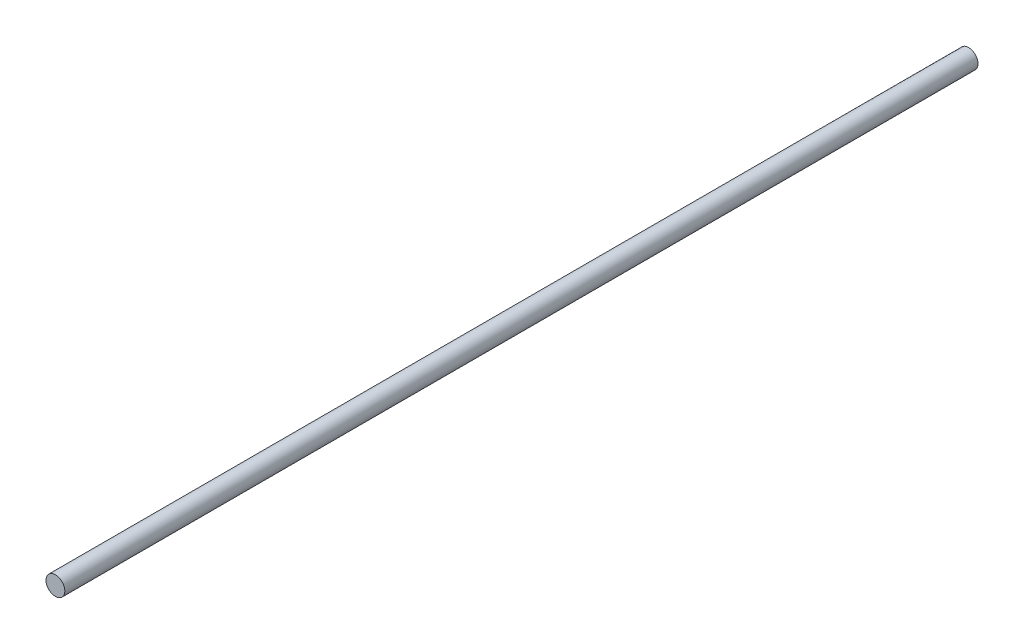
ISO-10303-21;
HEADER;
FILE_DESCRIPTION(('STEP AP214'),'2;1');
FILE_NAME('part.step','',(''),(''),'','','');
FILE_SCHEMA(('AUTOMOTIVE_DESIGN { 1 0 10303 214 1 1 1 1 }'));
ENDSEC;
DATA;
#1=APPLICATION_CONTEXT('core data for automotive mechanical design processes');
#2=APPLICATION_PROTOCOL_DEFINITION('international standard','automotive_design',2000,#1);
#3=PRODUCT_CONTEXT('',#1,'mechanical');
#4=PRODUCT('Part','Part','',(#3));
#5=PRODUCT_RELATED_PRODUCT_CATEGORY('part','',(#4));
#6=PRODUCT_DEFINITION_FORMATION('','',#4);
#7=PRODUCT_DEFINITION_CONTEXT('part definition',#1,'design');
#8=PRODUCT_DEFINITION('design','',#6,#7);
#9=PRODUCT_DEFINITION_SHAPE('','',#8);
#10=(LENGTH_UNIT() NAMED_UNIT(*) SI_UNIT(.MILLI.,.METRE.));
#11=(NAMED_UNIT(*) PLANE_ANGLE_UNIT() SI_UNIT($,.RADIAN.));
#12=(NAMED_UNIT(*) SI_UNIT($,.STERADIAN.) SOLID_ANGLE_UNIT());
#13=UNCERTAINTY_MEASURE_WITH_UNIT(LENGTH_MEASURE(1.E-05),#10,'distance_accuracy_value','');
#14=(GEOMETRIC_REPRESENTATION_CONTEXT(3) GLOBAL_UNCERTAINTY_ASSIGNED_CONTEXT((#13)) GLOBAL_UNIT_ASSIGNED_CONTEXT((#10,
#11,#12)) REPRESENTATION_CONTEXT('',''));
#15=CARTESIAN_POINT('',(0.,0.,0.));
#16=DIRECTION('',(0.,0.,1.));
#17=DIRECTION('',(1.,0.,0.));
#18=AXIS2_PLACEMENT_3D('',#15,#16,#17);
#19=CARTESIAN_POINT('',(0.,0.,582.));
#20=DIRECTION('',(0.,0.,-1.));
#21=DIRECTION('',(-1.,0.,0.));
#22=AXIS2_PLACEMENT_3D('',#19,#20,#21);
#23=CYLINDRICAL_SURFACE('',#22,6.);
#24=CARTESIAN_POINT('',(0.,0.,582.));
#25=DIRECTION('',(0.,0.,1.));
#26=DIRECTION('',(1.,0.,0.));
#27=AXIS2_PLACEMENT_3D('',#24,#25,#26);
#28=CIRCLE('',#27,6.);
#29=CARTESIAN_POINT('',(6.,0.,582.));
#30=VERTEX_POINT('',#29);
#31=EDGE_CURVE('E10',#30,#30,#28,.T.);
#32=ORIENTED_EDGE('',*,*,#31,.F.);
#33=EDGE_LOOP('',(#32));
#34=FACE_BOUND('',#33,.T.);
#35=CARTESIAN_POINT('',(0.,0.,0.));
#36=DIRECTION('',(0.,0.,1.));
#37=DIRECTION('',(1.,0.,0.));
#38=AXIS2_PLACEMENT_3D('',#35,#36,#37);
#39=CIRCLE('',#38,6.);
#40=CARTESIAN_POINT('',(6.,0.,0.));
#41=VERTEX_POINT('',#40);
#42=EDGE_CURVE('E34',#41,#41,#39,.T.);
#43=ORIENTED_EDGE('',*,*,#42,.T.);
#44=EDGE_LOOP('',(#43));
#45=FACE_BOUND('',#44,.T.);
#46=ADVANCED_FACE('F31',(#34,#45),#23,.T.);
#47=CARTESIAN_POINT('',(0.,0.,582.));
#48=DIRECTION('',(0.,0.,1.));
#49=DIRECTION('',(1.,0.,0.));
#50=AXIS2_PLACEMENT_3D('',#47,#48,#49);
#51=PLANE('',#50);
#52=ORIENTED_EDGE('',*,*,#31,.T.);
#53=EDGE_LOOP('',(#52));
#54=FACE_BOUND('',#53,.T.);
#55=ADVANCED_FACE('F46',(#54),#51,.T.);
#56=CARTESIAN_POINT('',(0.,0.,0.));
#57=DIRECTION('',(0.,0.,1.));
#58=DIRECTION('',(1.,0.,0.));
#59=AXIS2_PLACEMENT_3D('',#56,#57,#58);
#60=PLANE('',#59);
#61=ORIENTED_EDGE('',*,*,#42,.F.);
#62=EDGE_LOOP('',(#61));
#63=FACE_BOUND('',#62,.T.);
#64=ADVANCED_FACE('F44',(#63),#60,.F.);
#65=CLOSED_SHELL('',(#46,#55,#64));
#66=MANIFOLD_SOLID_BREP('B2',#65);
#67=ADVANCED_BREP_SHAPE_REPRESENTATION('',(#18,#66),#14);
#68=SHAPE_DEFINITION_REPRESENTATION(#9,#67);
ENDSEC;
END-ISO-10303-21;
